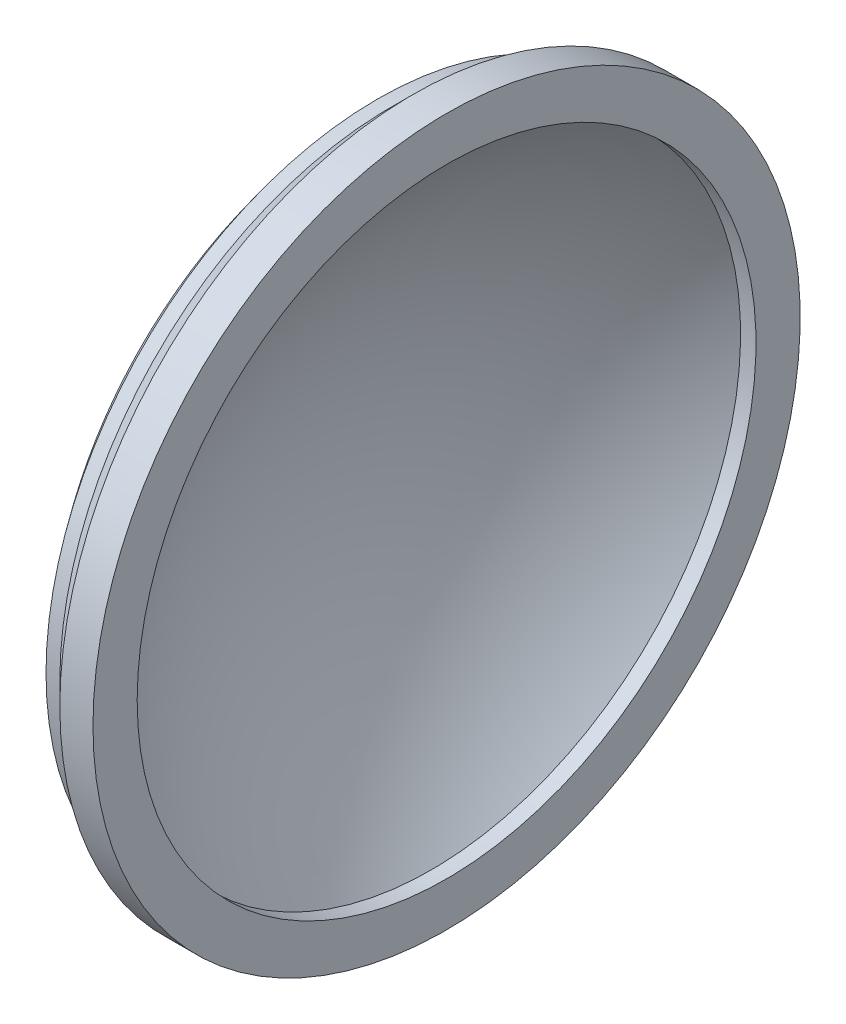
ISO-10303-21;
HEADER;
FILE_DESCRIPTION(('STEP AP214'),'2;1');
FILE_NAME('part.step','',(''),(''),'','','');
FILE_SCHEMA(('AUTOMOTIVE_DESIGN { 1 0 10303 214 1 1 1 1 }'));
ENDSEC;
DATA;
#1=APPLICATION_CONTEXT('core data for automotive mechanical design processes');
#2=APPLICATION_PROTOCOL_DEFINITION('international standard','automotive_design',2000,#1);
#3=PRODUCT_CONTEXT('',#1,'mechanical');
#4=PRODUCT('Part','Part','',(#3));
#5=PRODUCT_RELATED_PRODUCT_CATEGORY('part','',(#4));
#6=PRODUCT_DEFINITION_FORMATION('','',#4);
#7=PRODUCT_DEFINITION_CONTEXT('part definition',#1,'design');
#8=PRODUCT_DEFINITION('design','',#6,#7);
#9=PRODUCT_DEFINITION_SHAPE('','',#8);
#10=(LENGTH_UNIT() NAMED_UNIT(*) SI_UNIT(.MILLI.,.METRE.));
#11=(NAMED_UNIT(*) PLANE_ANGLE_UNIT() SI_UNIT($,.RADIAN.));
#12=(NAMED_UNIT(*) SI_UNIT($,.STERADIAN.) SOLID_ANGLE_UNIT());
#13=UNCERTAINTY_MEASURE_WITH_UNIT(LENGTH_MEASURE(1.E-05),#10,'distance_accuracy_value','');
#14=(GEOMETRIC_REPRESENTATION_CONTEXT(3) GLOBAL_UNCERTAINTY_ASSIGNED_CONTEXT((#13)) GLOBAL_UNIT_ASSIGNED_CONTEXT((#10,
#11,#12)) REPRESENTATION_CONTEXT('',''));
#15=CARTESIAN_POINT('',(0.,0.,0.));
#16=DIRECTION('',(0.,0.,1.));
#17=DIRECTION('',(1.,0.,0.));
#18=AXIS2_PLACEMENT_3D('',#15,#16,#17);
#19=CARTESIAN_POINT('',(45.1545993132812,0.,0.));
#20=DIRECTION('',(-1.,0.,0.));
#21=DIRECTION('',(0.,1.,0.));
#22=AXIS2_PLACEMENT_3D('',#19,#20,#21);
#23=SPHERICAL_SURFACE('',#22,95.);
#24=CARTESIAN_POINT('',(-28.5,0.,0.));
#25=DIRECTION('',(-1.,0.,0.));
#26=DIRECTION('',(0.,0.,1.));
#27=AXIS2_PLACEMENT_3D('',#24,#25,#26);
#28=CIRCLE('',#27,60.);
#29=CARTESIAN_POINT('',(-28.5,0.,60.));
#30=VERTEX_POINT('',#29);
#31=EDGE_CURVE('E53',#30,#30,#28,.T.);
#32=ORIENTED_EDGE('',*,*,#31,.T.);
#33=EDGE_LOOP('',(#32));
#34=FACE_BOUND('',#33,.T.);
#35=ADVANCED_FACE('F31',(#34),#23,.T.);
#36=CARTESIAN_POINT('',(45.1545993132812,0.,0.));
#37=DIRECTION('',(-1.,0.,0.));
#38=DIRECTION('',(0.,1.,0.));
#39=AXIS2_PLACEMENT_3D('',#36,#37,#38);
#40=SPHERICAL_SURFACE('',#39,85.);
#41=CARTESIAN_POINT('',(-18.7906898017115,0.,0.));
#42=DIRECTION('',(-1.,0.,0.));
#43=DIRECTION('',(0.,0.,1.));
#44=AXIS2_PLACEMENT_3D('',#41,#42,#43);
#45=CIRCLE('',#44,56.);
#46=CARTESIAN_POINT('',(-18.7906898017115,0.,56.));
#47=VERTEX_POINT('',#46);
#48=EDGE_CURVE('E10',#47,#47,#45,.T.);
#49=ORIENTED_EDGE('',*,*,#48,.F.);
#50=EDGE_LOOP('',(#49));
#51=FACE_BOUND('',#50,.T.);
#52=ADVANCED_FACE('F83',(#51),#40,.F.);
#53=CARTESIAN_POINT('',(-95.2866184722275,0.,0.));
#54=DIRECTION('',(-1.,0.,0.));
#55=DIRECTION('',(0.,0.,1.));
#56=AXIS2_PLACEMENT_3D('',#53,#54,#55);
#57=CYLINDRICAL_SURFACE('',#56,56.);
#58=CARTESIAN_POINT('',(-16.,0.,0.));
#59=DIRECTION('',(-1.,0.,0.));
#60=DIRECTION('',(0.,0.,1.));
#61=AXIS2_PLACEMENT_3D('',#58,#59,#60);
#62=CIRCLE('',#61,56.);
#63=CARTESIAN_POINT('',(-16.,0.,56.));
#64=VERTEX_POINT('',#63);
#65=EDGE_CURVE('E37',#64,#64,#62,.T.);
#66=ORIENTED_EDGE('',*,*,#65,.F.);
#67=EDGE_LOOP('',(#66));
#68=FACE_BOUND('',#67,.T.);
#69=ORIENTED_EDGE('',*,*,#48,.T.);
#70=EDGE_LOOP('',(#69));
#71=FACE_BOUND('',#70,.T.);
#72=ADVANCED_FACE('F78',(#68,#71),#57,.F.);
#73=CARTESIAN_POINT('',(-16.,64.,0.));
#74=DIRECTION('',(-1.,0.,0.));
#75=DIRECTION('',(0.,0.,1.));
#76=AXIS2_PLACEMENT_3D('',#73,#74,#75);
#77=PLANE('',#76);
#78=CARTESIAN_POINT('',(-16.,0.,0.));
#79=DIRECTION('',(-1.,0.,0.));
#80=DIRECTION('',(0.,0.,1.));
#81=AXIS2_PLACEMENT_3D('',#78,#79,#80);
#82=CIRCLE('',#81,64.);
#83=CARTESIAN_POINT('',(-16.,0.,64.));
#84=VERTEX_POINT('',#83);
#85=EDGE_CURVE('E41',#84,#84,#82,.T.);
#86=ORIENTED_EDGE('',*,*,#85,.F.);
#87=EDGE_LOOP('',(#86));
#88=FACE_BOUND('',#87,.T.);
#89=ORIENTED_EDGE('',*,*,#65,.T.);
#90=EDGE_LOOP('',(#89));
#91=FACE_BOUND('',#90,.T.);
#92=ADVANCED_FACE('F73',(#88,#91),#77,.F.);
#93=CARTESIAN_POINT('',(-95.2866184722275,0.,0.));
#94=DIRECTION('',(-1.,0.,0.));
#95=DIRECTION('',(0.,0.,1.));
#96=AXIS2_PLACEMENT_3D('',#93,#94,#95);
#97=CYLINDRICAL_SURFACE('',#96,64.);
#98=CARTESIAN_POINT('',(-22.,0.,0.));
#99=DIRECTION('',(-1.,0.,0.));
#100=DIRECTION('',(0.,0.,1.));
#101=AXIS2_PLACEMENT_3D('',#98,#99,#100);
#102=CIRCLE('',#101,64.);
#103=CARTESIAN_POINT('',(-22.,0.,64.));
#104=VERTEX_POINT('',#103);
#105=EDGE_CURVE('E45',#104,#104,#102,.T.);
#106=ORIENTED_EDGE('',*,*,#105,.F.);
#107=EDGE_LOOP('',(#106));
#108=FACE_BOUND('',#107,.T.);
#109=ORIENTED_EDGE('',*,*,#85,.T.);
#110=EDGE_LOOP('',(#109));
#111=FACE_BOUND('',#110,.T.);
#112=ADVANCED_FACE('F67',(#108,#111),#97,.T.);
#113=CARTESIAN_POINT('',(-22.,0.,0.));
#114=DIRECTION('',(1.,0.,0.));
#115=DIRECTION('',(0.,0.,-1.));
#116=AXIS2_PLACEMENT_3D('',#113,#114,#115);
#117=CONICAL_SURFACE('',#116,64.,0.78539816339745);
#118=CARTESIAN_POINT('',(-26.,0.,0.));
#119=DIRECTION('',(-1.,0.,0.));
#120=DIRECTION('',(0.,0.,1.));
#121=AXIS2_PLACEMENT_3D('',#118,#119,#120);
#122=CIRCLE('',#121,60.);
#123=CARTESIAN_POINT('',(-26.,0.,60.));
#124=VERTEX_POINT('',#123);
#125=EDGE_CURVE('E50',#124,#124,#122,.T.);
#126=ORIENTED_EDGE('',*,*,#125,.F.);
#127=EDGE_LOOP('',(#126));
#128=FACE_BOUND('',#127,.T.);
#129=ORIENTED_EDGE('',*,*,#105,.T.);
#130=EDGE_LOOP('',(#129));
#131=FACE_BOUND('',#130,.T.);
#132=ADVANCED_FACE('F61',(#128,#131),#117,.T.);
#133=CARTESIAN_POINT('',(-95.2866184722275,0.,0.));
#134=DIRECTION('',(-1.,0.,0.));
#135=DIRECTION('',(0.,0.,1.));
#136=AXIS2_PLACEMENT_3D('',#133,#134,#135);
#137=CYLINDRICAL_SURFACE('',#136,60.);
#138=ORIENTED_EDGE('',*,*,#31,.F.);
#139=EDGE_LOOP('',(#138));
#140=FACE_BOUND('',#139,.T.);
#141=ORIENTED_EDGE('',*,*,#125,.T.);
#142=EDGE_LOOP('',(#141));
#143=FACE_BOUND('',#142,.T.);
#144=ADVANCED_FACE('F58',(#140,#143),#137,.T.);
#145=CLOSED_SHELL('',(#35,#52,#72,#92,#112,#132,#144));
#146=MANIFOLD_SOLID_BREP('B2',#145);
#147=ADVANCED_BREP_SHAPE_REPRESENTATION('',(#18,#146),#14);
#148=SHAPE_DEFINITION_REPRESENTATION(#9,#147);
ENDSEC;
END-ISO-10303-21;
